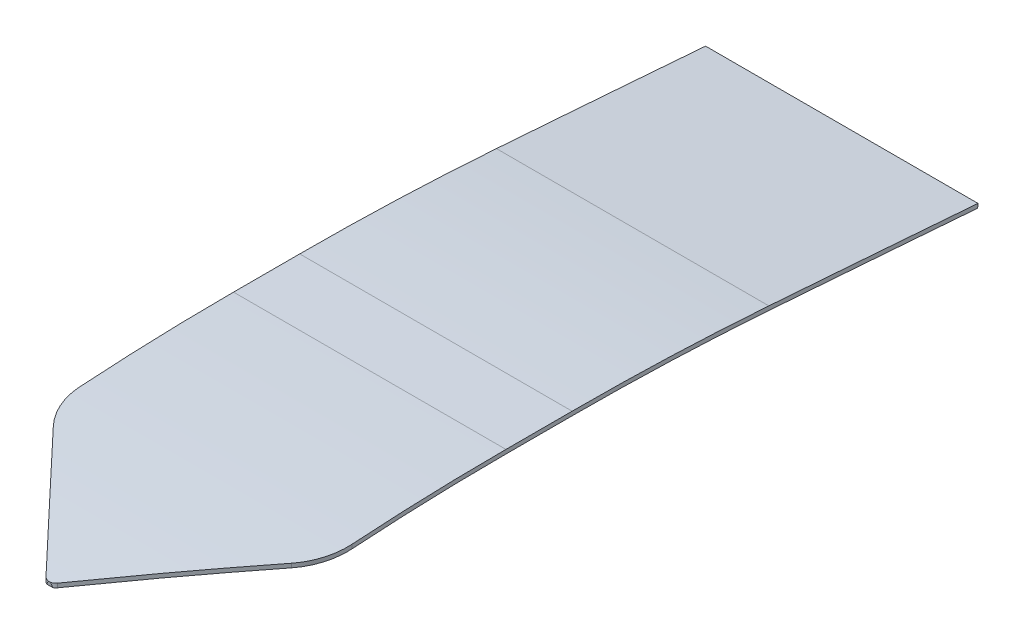
ISO-10303-21;
HEADER;
FILE_DESCRIPTION(('STEP AP214'),'2;1');
FILE_NAME('part.step','',(''),(''),'','','');
FILE_SCHEMA(('AUTOMOTIVE_DESIGN { 1 0 10303 214 1 1 1 1 }'));
ENDSEC;
DATA;
#1=APPLICATION_CONTEXT('core data for automotive mechanical design processes');
#2=APPLICATION_PROTOCOL_DEFINITION('international standard','automotive_design',2000,#1);
#3=PRODUCT_CONTEXT('',#1,'mechanical');
#4=PRODUCT('Part','Part','',(#3));
#5=PRODUCT_RELATED_PRODUCT_CATEGORY('part','',(#4));
#6=PRODUCT_DEFINITION_FORMATION('','',#4);
#7=PRODUCT_DEFINITION_CONTEXT('part definition',#1,'design');
#8=PRODUCT_DEFINITION('design','',#6,#7);
#9=PRODUCT_DEFINITION_SHAPE('','',#8);
#10=(LENGTH_UNIT() NAMED_UNIT(*) SI_UNIT(.MILLI.,.METRE.));
#11=(NAMED_UNIT(*) PLANE_ANGLE_UNIT() SI_UNIT($,.RADIAN.));
#12=(NAMED_UNIT(*) SI_UNIT($,.STERADIAN.) SOLID_ANGLE_UNIT());
#13=UNCERTAINTY_MEASURE_WITH_UNIT(LENGTH_MEASURE(1.E-05),#10,'distance_accuracy_value','');
#14=(GEOMETRIC_REPRESENTATION_CONTEXT(3) GLOBAL_UNCERTAINTY_ASSIGNED_CONTEXT((#13)) GLOBAL_UNIT_ASSIGNED_CONTEXT((#10,
#11,#12)) REPRESENTATION_CONTEXT('',''));
#15=CARTESIAN_POINT('',(0.,0.,0.));
#16=DIRECTION('',(0.,0.,1.));
#17=DIRECTION('',(1.,0.,0.));
#18=AXIS2_PLACEMENT_3D('',#15,#16,#17);
#19=CARTESIAN_POINT('',(45.2232043677211,2377.51338000155,4691.88338211628));
#20=DIRECTION('',(0.,-0.139077666980122,0.990281476423429));
#21=DIRECTION('',(0.,-0.990281476423429,-0.139077666980122));
#22=AXIS2_PLACEMENT_3D('',#19,#20,#21);
#23=PLANE('',#22);
#24=CARTESIAN_POINT('',(914.223204367722,2021.49594818593,4641.88338211628));
#25=DIRECTION('',(0.,-0.139077666980122,0.990281476423429));
#26=DIRECTION('',(0.,-0.990281476423429,-0.139077666980122));
#27=AXIS2_PLACEMENT_3D('',#24,#25,#26);
#28=ELLIPSE('',#27,359.511351359852,49.9999999999991);
#29=CARTESIAN_POINT('',(895.763025496517,2352.36023050039,4688.35080937499));
#30=VERTEX_POINT('',#29);
#31=CARTESIAN_POINT('',(914.223204367722,2377.51338000155,4691.88338211628));
#32=VERTEX_POINT('',#31);
#33=EDGE_CURVE('E270',#30,#32,#28,.F.);
#34=ORIENTED_EDGE('',*,*,#33,.F.);
#35=DIRECTION('',(1.,0.,0.));
#36=VECTOR('',#35,1.);
#37=CARTESIAN_POINT('',(45.2232043677211,2352.36023050039,4688.35080937499));
#38=LINE('',#37,#36);
#39=CARTESIAN_POINT('',(932.683383238927,2352.36023050039,4688.35080937499));
#40=VERTEX_POINT('',#39);
#41=EDGE_CURVE('E199',#30,#40,#38,.T.);
#42=ORIENTED_EDGE('',*,*,#41,.T.);
#43=EDGE_CURVE('E271',#32,#40,#28,.F.);
#44=ORIENTED_EDGE('',*,*,#43,.F.);
#45=EDGE_LOOP('',(#34,#42,#44));
#46=FACE_BOUND('',#45,.T.);
#47=ADVANCED_FACE('F37',(#46),#23,.T.);
#48=CARTESIAN_POINT('',(45.2232043677211,-264700.723222564,20532.1872081631));
#49=DIRECTION('',(1.,0.,0.));
#50=DIRECTION('',(0.,0.,-1.));
#51=AXIS2_PLACEMENT_3D('',#48,#49,#50);
#52=CYLINDRICAL_SURFACE('',#51,267886.279258507);
#53=CARTESIAN_POINT('',(1773.22320436773,-264700.723222564,20532.1872081631));
#54=DIRECTION('',(-1.,0.,0.));
#55=DIRECTION('',(0.,0.,1.));
#56=AXIS2_PLACEMENT_3D('',#53,#54,#55);
#57=CIRCLE('',#56,267886.279258507);
#58=CARTESIAN_POINT('',(1773.22320436772,2373.84259870677,-306.11661788372));
#59=VERTEX_POINT('',#58);
#60=CARTESIAN_POINT('',(1773.22320436772,2473.47300835498,1012.77422187486));
#61=VERTEX_POINT('',#60);
#62=EDGE_CURVE('E175',#59,#61,#57,.F.);
#63=ORIENTED_EDGE('',*,*,#62,.F.);
#64=DIRECTION('',(1.,0.,0.));
#65=VECTOR('',#64,1.);
#66=CARTESIAN_POINT('',(45.2232043677211,2373.84259870677,-306.11661788372));
#67=LINE('',#66,#65);
#68=CARTESIAN_POINT('',(55.2232043677214,2373.84259870683,-306.116617883722));
#69=VERTEX_POINT('',#68);
#70=EDGE_CURVE('E169',#69,#59,#67,.T.);
#71=ORIENTED_EDGE('',*,*,#70,.F.);
#72=CARTESIAN_POINT('',(55.2232043677226,-264700.723222564,20532.1872081631));
#73=DIRECTION('',(1.,0.,0.));
#74=DIRECTION('',(0.,0.,-1.));
#75=AXIS2_PLACEMENT_3D('',#72,#73,#74);
#76=CIRCLE('',#75,267886.279258507);
#77=CARTESIAN_POINT('',(55.2232043677215,2473.47300835498,1012.77422187486));
#78=VERTEX_POINT('',#77);
#79=EDGE_CURVE('E152',#78,#69,#76,.F.);
#80=ORIENTED_EDGE('',*,*,#79,.F.);
#81=DIRECTION('',(1.,0.,0.));
#82=VECTOR('',#81,1.);
#83=CARTESIAN_POINT('',(45.2232043677211,2473.47300835497,1012.77422187486));
#84=LINE('',#83,#82);
#85=EDGE_CURVE('E208',#78,#61,#84,.T.);
#86=ORIENTED_EDGE('',*,*,#85,.T.);
#87=EDGE_LOOP('',(#63,#71,#80,#86));
#88=FACE_BOUND('',#87,.T.);
#89=ADVANCED_FACE('F39',(#88),#52,.T.);
#90=CARTESIAN_POINT('',(45.2232043677211,2373.84259870677,-306.11661788372));
#91=DIRECTION('',(0.,-0.0777878728384363,-0.996969932765914));
#92=DIRECTION('',(0.,0.996969932765914,-0.0777878728384363));
#93=AXIS2_PLACEMENT_3D('',#90,#91,#92);
#94=PLANE('',#93);
#95=DIRECTION('',(0.,0.996969932765914,-0.0777878728384363));
#96=VECTOR('',#95,1.);
#97=CARTESIAN_POINT('',(1773.22320436772,2373.84259870677,-306.11661788372));
#98=LINE('',#97,#96);
#99=CARTESIAN_POINT('',(1773.22320436772,2348.51956241448,-304.14080591362));
#100=VERTEX_POINT('',#99);
#101=EDGE_CURVE('E335',#100,#59,#98,.T.);
#102=ORIENTED_EDGE('',*,*,#101,.F.);
#103=DIRECTION('',(1.,0.,0.));
#104=VECTOR('',#103,1.);
#105=CARTESIAN_POINT('',(45.2232043677211,2348.51956241448,-304.140805913644));
#106=LINE('',#105,#104);
#107=CARTESIAN_POINT('',(55.2232043677214,2348.51956241448,-304.14080591362));
#108=VERTEX_POINT('',#107);
#109=EDGE_CURVE('E171',#108,#100,#106,.T.);
#110=ORIENTED_EDGE('',*,*,#109,.F.);
#111=DIRECTION('',(0.,-0.996969932765914,0.0777878728384363));
#112=VECTOR('',#111,1.);
#113=CARTESIAN_POINT('',(55.2232043677214,2373.84259870677,-306.11661788372));
#114=LINE('',#113,#112);
#115=EDGE_CURVE('E155',#69,#108,#114,.T.);
#116=ORIENTED_EDGE('',*,*,#115,.F.);
#117=ORIENTED_EDGE('',*,*,#70,.T.);
#118=EDGE_LOOP('',(#102,#110,#116,#117));
#119=FACE_BOUND('',#118,.T.);
#120=ADVANCED_FACE('F168',(#119),#94,.T.);
#121=CARTESIAN_POINT('',(45.2232043677211,-264700.723222564,20532.1872081631));
#122=DIRECTION('',(1.,0.,0.));
#123=DIRECTION('',(0.,0.,-1.));
#124=AXIS2_PLACEMENT_3D('',#121,#122,#123);
#125=CYLINDRICAL_SURFACE('',#124,267860.879258507);
#126=CARTESIAN_POINT('',(1773.22320436773,-264700.723222564,20532.1872081631));
#127=DIRECTION('',(-1.,0.,0.));
#128=DIRECTION('',(0.,0.,1.));
#129=AXIS2_PLACEMENT_3D('',#126,#127,#128);
#130=CIRCLE('',#129,267860.879258507);
#131=CARTESIAN_POINT('',(1773.22320436772,2448.14052547071,1014.62498142564));
#132=VERTEX_POINT('',#131);
#133=EDGE_CURVE('E337',#132,#100,#130,.T.);
#134=ORIENTED_EDGE('',*,*,#133,.F.);
#135=DIRECTION('',(1.,0.,0.));
#136=VECTOR('',#135,1.);
#137=CARTESIAN_POINT('',(45.2232043677211,2448.14052547069,1014.62498142564));
#138=LINE('',#137,#136);
#139=CARTESIAN_POINT('',(55.2232043677215,2448.14052547071,1014.62498142564));
#140=VERTEX_POINT('',#139);
#141=EDGE_CURVE('E179',#140,#132,#138,.T.);
#142=ORIENTED_EDGE('',*,*,#141,.F.);
#143=CARTESIAN_POINT('',(55.2232043677226,-264700.723222564,20532.1872081631));
#144=DIRECTION('',(1.,0.,0.));
#145=DIRECTION('',(0.,0.,-1.));
#146=AXIS2_PLACEMENT_3D('',#143,#144,#145);
#147=CIRCLE('',#146,267860.879258507);
#148=EDGE_CURVE('E172',#108,#140,#147,.T.);
#149=ORIENTED_EDGE('',*,*,#148,.F.);
#150=ORIENTED_EDGE('',*,*,#109,.T.);
#151=EDGE_LOOP('',(#134,#142,#149,#150));
#152=FACE_BOUND('',#151,.T.);
#153=ADVANCED_FACE('F282',(#152),#125,.F.);
#154=CARTESIAN_POINT('',(45.2232043677211,-14509.8457253538,2253.55427068807));
#155=DIRECTION('',(1.,0.,0.));
#156=DIRECTION('',(0.,0.,-1.));
#157=AXIS2_PLACEMENT_3D('',#154,#155,#156);
#158=CYLINDRICAL_SURFACE('',#157,17003.1833333334);
#159=CARTESIAN_POINT('',(1773.22320436772,-14509.8457253538,2253.55427068807));
#160=DIRECTION('',(-1.,0.,0.));
#161=DIRECTION('',(0.,0.,1.));
#162=AXIS2_PLACEMENT_3D('',#159,#160,#161);
#163=CIRCLE('',#162,17003.1833333334);
#164=CARTESIAN_POINT('',(1773.22320436772,2493.33760797954,2253.55427068807));
#165=VERTEX_POINT('',#164);
#166=EDGE_CURVE('E339',#165,#132,#163,.T.);
#167=ORIENTED_EDGE('',*,*,#166,.F.);
#168=DIRECTION('',(1.,0.,0.));
#169=VECTOR('',#168,1.);
#170=CARTESIAN_POINT('',(45.2232043677211,2493.33760797949,2253.55427068807));
#171=LINE('',#170,#169);
#172=CARTESIAN_POINT('',(55.2232043677216,2493.33760797954,2253.55427068807));
#173=VERTEX_POINT('',#172);
#174=EDGE_CURVE('E193',#173,#165,#171,.T.);
#175=ORIENTED_EDGE('',*,*,#174,.F.);
#176=CARTESIAN_POINT('',(55.2232043677216,-14509.8457253538,2253.55427068807));
#177=DIRECTION('',(1.,0.,0.));
#178=DIRECTION('',(0.,0.,-1.));
#179=AXIS2_PLACEMENT_3D('',#176,#177,#178);
#180=CIRCLE('',#179,17003.1833333334);
#181=EDGE_CURVE('E324',#140,#173,#180,.T.);
#182=ORIENTED_EDGE('',*,*,#181,.F.);
#183=ORIENTED_EDGE('',*,*,#141,.T.);
#184=EDGE_LOOP('',(#167,#175,#182,#183));
#185=FACE_BOUND('',#184,.T.);
#186=ADVANCED_FACE('F284',(#185),#158,.F.);
#187=CARTESIAN_POINT('',(45.2232043677211,2493.33760797949,2670.88338211628));
#188=DIRECTION('',(0.,-1.,0.));
#189=DIRECTION('',(0.,0.,-1.));
#190=AXIS2_PLACEMENT_3D('',#187,#188,#189);
#191=PLANE('',#190);
#192=DIRECTION('',(0.,0.,-1.));
#193=VECTOR('',#192,1.);
#194=CARTESIAN_POINT('',(1773.22320436772,2493.33760797949,2670.88338211628));
#195=LINE('',#194,#193);
#196=CARTESIAN_POINT('',(1773.22320436772,2493.33760797949,2670.88338211628));
#197=VERTEX_POINT('',#196);
#198=EDGE_CURVE('E341',#197,#165,#195,.T.);
#199=ORIENTED_EDGE('',*,*,#198,.F.);
#200=DIRECTION('',(1.,0.,0.));
#201=VECTOR('',#200,1.);
#202=CARTESIAN_POINT('',(45.2232043677211,2493.33760797949,2670.88338211628));
#203=LINE('',#202,#201);
#204=CARTESIAN_POINT('',(55.2232043677216,2493.33760797949,2670.88338211628));
#205=VERTEX_POINT('',#204);
#206=EDGE_CURVE('E196',#205,#197,#203,.T.);
#207=ORIENTED_EDGE('',*,*,#206,.F.);
#208=DIRECTION('',(0.,0.,1.));
#209=VECTOR('',#208,1.);
#210=CARTESIAN_POINT('',(55.2232043677216,2493.33760797949,2670.88338211628));
#211=LINE('',#210,#209);
#212=EDGE_CURVE('E326',#173,#205,#211,.T.);
#213=ORIENTED_EDGE('',*,*,#212,.F.);
#214=ORIENTED_EDGE('',*,*,#174,.T.);
#215=EDGE_LOOP('',(#199,#207,#213,#214));
#216=FACE_BOUND('',#215,.T.);
#217=ADVANCED_FACE('F259',(#216),#191,.T.);
#218=CARTESIAN_POINT('',(45.2232043677211,-12012.7112139923,2670.88338211628));
#219=DIRECTION('',(1.,0.,0.));
#220=DIRECTION('',(0.,0.,-1.));
#221=AXIS2_PLACEMENT_3D('',#218,#219,#220);
#222=CYLINDRICAL_SURFACE('',#221,14506.0488219718);
#223=CARTESIAN_POINT('',(932.683383238925,2352.36023050039,4688.35080937499));
#224=CARTESIAN_POINT('',(933.341442367758,2352.39694465635,4688.08939134966));
#225=CARTESIAN_POINT('',(933.993840519336,2352.43561166281,4687.81401739661));
#226=CARTESIAN_POINT('',(935.286167259724,2352.51676767956,4687.23591718592));
#227=CARTESIAN_POINT('',(935.926095757157,2352.55925671784,4686.93319072793));
#228=CARTESIAN_POINT('',(937.192614543316,2352.64799278347,4686.30080478515));
#229=CARTESIAN_POINT('',(937.819198618152,2352.69424151526,4685.97113308452));
#230=CARTESIAN_POINT('',(939.057550258622,2352.79038104461,4685.28564288533));
#231=CARTESIAN_POINT('',(939.669318047082,2352.84027178737,4684.92982478033));
#232=CARTESIAN_POINT('',(941.458881344512,2352.99338892204,4683.83748533384));
#233=CARTESIAN_POINT('',(942.614203932002,2353.10169483297,4683.06443247719));
#234=CARTESIAN_POINT('',(944.855043683963,2353.33109566457,4681.42596207093));
#235=CARTESIAN_POINT('',(945.940602322678,2353.45218287154,4680.56060022784));
#236=CARTESIAN_POINT('',(947.308591228943,2353.61811529406,4679.37388669945));
#237=CARTESIAN_POINT('',(947.625940812935,2353.65760370346,4679.09141492476));
#238=CARTESIAN_POINT('',(948.253224670541,2353.73766542757,4678.51858405135));
#239=CARTESIAN_POINT('',(948.56316027037,2353.77823854544,4678.22822638342));
#240=CARTESIAN_POINT('',(949.177185712854,2353.86067780513,4677.63812360825));
#241=CARTESIAN_POINT('',(949.481232653833,2353.90254995547,4677.33833474451));
#242=CARTESIAN_POINT('',(950.081531201921,2353.98734529348,4676.73108971094));
#243=CARTESIAN_POINT('',(950.37778141235,2354.03026866683,4676.42363218633));
#244=CARTESIAN_POINT('',(950.670011748799,2354.07369926341,4676.11246670419));
#245=B_SPLINE_CURVE_WITH_KNOTS('',3,(#223,#224,#225,#226,#227,#228,#229,#230,#231,#232,#233,
#234,#235,#236,#237,#238,#239,#240,#241,#242,#243,#244),.UNSPECIFIED.,.F.,.F.,(4,2,2,2,2,2,2,2,
2,2,4),(0.,2.12692618644326,4.2538679531693,6.3817793920735,8.50965880887939,12.6874613425271,
16.8627567730322,18.142727355165,19.4224672375952,20.7094348068825,21.9966313714263),.UNSPECIFIED.);
#246=CARTESIAN_POINT('',(950.670011748799,2354.07369926341,4676.11246670419));
#247=VERTEX_POINT('',#246);
#248=EDGE_CURVE('E182',#40,#247,#245,.T.);
#249=ORIENTED_EDGE('',*,*,#248,.F.);
#250=ORIENTED_EDGE('',*,*,#41,.F.);
#251=CARTESIAN_POINT('',(877.776396986645,2354.07369926341,4676.11246670419));
#252=CARTESIAN_POINT('',(878.259275190629,2354.00193356546,4676.62664365774));
#253=CARTESIAN_POINT('',(878.753140266467,2353.93155365623,4677.13069004759));
#254=CARTESIAN_POINT('',(879.761972475992,2353.793695661,4678.11763712768));
#255=CARTESIAN_POINT('',(880.276940007072,2353.72621762971,4678.60053741935));
#256=CARTESIAN_POINT('',(881.327376734287,2353.59425997595,4679.54454850722));
#257=CARTESIAN_POINT('',(881.86285707957,2353.52978202749,4680.00564714064));
#258=CARTESIAN_POINT('',(882.953055787725,2353.40399554704,4680.90487896266));
#259=CARTESIAN_POINT('',(883.507773800373,2353.34268695742,4681.34301256898));
#260=CARTESIAN_POINT('',(885.178822692211,2353.16586936609,4682.60621729297));
#261=CARTESIAN_POINT('',(886.321462773817,2353.05503311584,4683.39751142927));
#262=CARTESIAN_POINT('',(888.668883830047,2352.84695416432,4684.88226613484));
#263=CARTESIAN_POINT('',(889.873625086204,2352.74970291853,4685.57578820214));
#264=CARTESIAN_POINT('',(891.482695084165,2352.6319913338,4686.41484006754));
#265=CARTESIAN_POINT('',(891.86275519936,2352.60504497918,4686.60688519246));
#266=CARTESIAN_POINT('',(892.627685844551,2352.55251411081,4686.98121784292));
#267=CARTESIAN_POINT('',(893.012555520853,2352.52692935952,4687.16350707062));
#268=CARTESIAN_POINT('',(893.789091400089,2352.47699645283,4687.51922836298));
#269=CARTESIAN_POINT('',(894.180783768897,2352.45265613317,4687.69260433496));
#270=CARTESIAN_POINT('',(894.9686348429,2352.40538237009,4688.02929334449));
#271=CARTESIAN_POINT('',(895.364794315635,2352.38244917295,4688.19260462056));
#272=CARTESIAN_POINT('',(895.763025496519,2352.36023050039,4688.35080937499));
#273=B_SPLINE_CURVE_WITH_KNOTS('',3,(#251,#252,#253,#254,#255,#256,#257,#258,#259,#260,#261,
#262,#263,#264,#265,#266,#267,#268,#269,#270,#271,#272),.UNSPECIFIED.,.F.,.F.,(4,2,2,2,2,2,2,2,
2,2,4),(0.,2.1268720399877,4.25378415081409,6.38186915845638,8.50991544425092,12.6876720812845,
16.8627890973179,18.1427323273964,19.4224515071806,20.709428118154,21.9966293333857),.UNSPECIFIED.);
#274=CARTESIAN_POINT('',(877.776396986645,2354.07369926341,4676.11246670419));
#275=VERTEX_POINT('',#274);
#276=EDGE_CURVE('E66',#275,#30,#273,.T.);
#277=ORIENTED_EDGE('',*,*,#276,.F.);
#278=CARTESIAN_POINT('',(-1005.43809795815,-12012.7112139923,2670.88338211628));
#279=DIRECTION('',(0.728936147621554,0.,-0.684581691758294));
#280=DIRECTION('',(0.684581691758294,0.,0.728936147621554));
#281=AXIS2_PLACEMENT_3D('',#278,#279,#280);
#282=ELLIPSE('',#281,19900.3011022345,14506.0488219718);
#283=CARTESIAN_POINT('',(163.6487453191,2439.82641897862,3915.7160588196));
#284=VERTEX_POINT('',#283);
#285=EDGE_CURVE('E248',#284,#275,#282,.T.);
#286=ORIENTED_EDGE('',*,*,#285,.F.);
#287=CARTESIAN_POINT('',(55.223204367722,2460.80292133189,3641.88338211628));
#288=CARTESIAN_POINT('',(55.2232039741585,2460.61391931573,3644.70060950368));
#289=CARTESIAN_POINT('',(55.2529681342459,2460.42409933992,3647.51770326978));
#290=CARTESIAN_POINT('',(55.3719974064149,2460.04290125643,3653.15051077667));
#291=CARTESIAN_POINT('',(55.4612621557714,2459.85152315826,3655.96622452576));
#292=CARTESIAN_POINT('',(55.818252136738,2459.27518662316,3664.40935970784));
#293=CARTESIAN_POINT('',(56.1751731079108,2458.88800454576,3670.03309404743));
#294=CARTESIAN_POINT('',(57.1262144592865,2458.10849425698,3681.26007410751));
#295=CARTESIAN_POINT('',(57.7203332874732,2457.71616607928,3686.86331996182));
#296=CARTESIAN_POINT('',(58.7885027266679,2457.1244300353,3695.24499265891));
#297=CARTESIAN_POINT('',(59.1740631127102,2456.92664179741,3698.03504903783));
#298=CARTESIAN_POINT('',(60.004039098009,2456.53006425242,3703.60650931769));
#299=CARTESIAN_POINT('',(60.4484585314915,2456.33127488092,3706.38791264286));
#300=CARTESIAN_POINT('',(61.8708045981704,2455.73311028724,3714.72355998896));
#301=CARTESIAN_POINT('',(62.9370089421707,2455.3323874279,3720.26288470834));
#302=CARTESIAN_POINT('',(65.3026627321889,2454.52826107803,3731.2913060384));
#303=CARTESIAN_POINT('',(66.6021122258106,2454.12485758696,3736.78040263881));
#304=CARTESIAN_POINT('',(68.7243468140056,2453.51844776769,3744.96871077912));
#305=CARTESIAN_POINT('',(69.4606157967758,2453.3160902613,3747.69063683057));
#306=CARTESIAN_POINT('',(70.9904826275301,2452.91106175908,3753.11810974383));
#307=CARTESIAN_POINT('',(71.7840767306166,2452.70839078458,3755.82365766309));
#308=CARTESIAN_POINT('',(74.2504446497932,2452.10005515378,3763.91431608964));
#309=CARTESIAN_POINT('',(76.008837924964,2451.69405811608,3769.27357185834));
#310=CARTESIAN_POINT('',(79.7516882924569,2450.88196954528,3779.91590945318));
#311=CARTESIAN_POINT('',(81.7362772354231,2450.4758780962,3785.19894480801));
#312=CARTESIAN_POINT('',(85.927203754222,2449.66482350464,3795.67642288359));
#313=CARTESIAN_POINT('',(88.1335419959035,2449.25986036555,3800.87086533827));
#314=CARTESIAN_POINT('',(92.7645125790225,2448.45200962682,3811.16286180976));
#315=CARTESIAN_POINT('',(95.1891793170256,2448.04912236485,3816.2604004061));
#316=CARTESIAN_POINT('',(98.9861710967571,2447.44722219097,3823.82606471086));
#317=CARTESIAN_POINT('',(100.278508794284,2447.24699268801,3826.33452748728));
#318=CARTESIAN_POINT('',(102.91609181821,2446.8474511575,3831.32377169471));
#319=CARTESIAN_POINT('',(104.261340609985,2446.64813919101,3833.80455129892));
#320=CARTESIAN_POINT('',(108.369099486819,2446.05271978606,3841.19201774405));
#321=CARTESIAN_POINT('',(111.209596576016,2445.6581814774,3846.05573485811));
#322=CARTESIAN_POINT('',(117.093617257916,2444.8744050214,3855.65918602735));
#323=CARTESIAN_POINT('',(120.137140278273,2444.48516685913,3860.39892043199));
#324=CARTESIAN_POINT('',(124.849772746383,2443.90619613452,3867.40792314061));
#325=CARTESIAN_POINT('',(126.444870712127,2443.71405868068,3869.7270319969));
#326=CARTESIAN_POINT('',(129.683619824998,2443.33152128008,3874.3310116714));
#327=CARTESIAN_POINT('',(131.327268196573,2443.14112123481,3876.61588443563));
#328=CARTESIAN_POINT('',(136.329787879781,2442.57274985391,3883.41735944796));
#329=CARTESIAN_POINT('',(139.760771675227,2442.19754115484,3887.88161843164));
#330=CARTESIAN_POINT('',(144.905500435811,2441.65595319808,3894.29105437421));
#331=CARTESIAN_POINT('',(146.546311165779,2441.4861940148,3896.29502597016));
#332=CARTESIAN_POINT('',(149.866375084172,2441.14860529938,3900.27051717196));
#333=CARTESIAN_POINT('',(151.545621535275,2440.98077543669,3902.24204236268));
#334=CARTESIAN_POINT('',(154.940334737598,2440.64730365408,3906.15008521847));
#335=CARTESIAN_POINT('',(156.655760510094,2440.48165957141,3908.08663831652));
#336=CARTESIAN_POINT('',(160.124248484512,2440.15244844874,3911.92652993114));
#337=CARTESIAN_POINT('',(161.877317124839,2439.9888817718,3913.82986266316));
#338=CARTESIAN_POINT('',(163.6487453191,2439.82641897863,3915.7160588196));
#339=B_SPLINE_CURVE_WITH_KNOTS('',3,(#287,#288,#289,#290,#291,#292,#293,#294,#295,#296,#297,
#298,#299,#300,#301,#302,#303,#304,#305,#306,#307,#308,#309,#310,#311,#312,#313,#314,#315,#316,
#317,#318,#319,#320,#321,#322,#323,#324,#325,#326,#327,#328,#329,#330,#331,#332,#333,#334,#335,
#336,#337,#338),.UNSPECIFIED.,.F.,.F.,(4,2,2,2,2,2,2,2,2,2,2,2,2,2,2,2,2,2,2,2,2,2,2,2,2,4),(0.,
8.47036647291138,16.9406813095799,33.8803526973032,50.8199132483838,59.2898855411439,
67.7604098607774,84.7207141456213,101.681021891958,110.161465638647,118.641355880663,
135.600730928071,152.57004273624,169.53940549986,186.511446395171,194.997571869619,
203.484254065534,220.417596344696,237.350890889486,245.814115315624,254.27685684522,
271.19944317773,278.98580513598,286.7708125352,294.547431249642,302.325390835472),.UNSPECIFIED.);
#340=CARTESIAN_POINT('',(55.2232043677217,2460.80292133189,3641.88338211628));
#341=VERTEX_POINT('',#340);
#342=EDGE_CURVE('E240',#341,#284,#339,.T.);
#343=ORIENTED_EDGE('',*,*,#342,.F.);
#344=CARTESIAN_POINT('',(55.2232043677216,-12012.7112139923,2670.88338211628));
#345=DIRECTION('',(1.,0.,0.));
#346=DIRECTION('',(0.,0.,-1.));
#347=AXIS2_PLACEMENT_3D('',#344,#345,#346);
#348=CIRCLE('',#347,14506.0488219718);
#349=EDGE_CURVE('E328',#205,#341,#348,.T.);
#350=ORIENTED_EDGE('',*,*,#349,.F.);
#351=ORIENTED_EDGE('',*,*,#206,.T.);
#352=CARTESIAN_POINT('',(1773.22320436772,-12012.7112139923,2670.88338211628));
#353=DIRECTION('',(-1.,0.,0.));
#354=DIRECTION('',(0.,0.,1.));
#355=AXIS2_PLACEMENT_3D('',#352,#353,#354);
#356=CIRCLE('',#355,14506.0488219718);
#357=CARTESIAN_POINT('',(1773.22320436772,2460.80292133189,3641.88338211628));
#358=VERTEX_POINT('',#357);
#359=EDGE_CURVE('E342',#358,#197,#356,.T.);
#360=ORIENTED_EDGE('',*,*,#359,.F.);
#361=CARTESIAN_POINT('',(1664.79766341634,2439.82641897862,3915.7160588196));
#362=CARTESIAN_POINT('',(1666.72627715377,2440.00329798813,3913.66248959705));
#363=CARTESIAN_POINT('',(1668.63308459297,2440.18148092235,3911.58866151491));
#364=CARTESIAN_POINT('',(1672.40234890509,2440.54033131731,3907.40131935892));
#365=CARTESIAN_POINT('',(1674.26480605295,2440.72099876265,3905.28780553123));
#366=CARTESIAN_POINT('',(1679.78436957252,2441.26652534247,3898.88918905159));
#367=CARTESIAN_POINT('',(1683.37388937959,2441.63492903509,3894.54577569072));
#368=CARTESIAN_POINT('',(1690.36589114484,2442.38007708064,3885.71169913934));
#369=CARTESIAN_POINT('',(1693.76837521365,2442.75682133936,3881.22103761139));
#370=CARTESIAN_POINT('',(1698.72715968395,2443.32736255762,3874.38092480678));
#371=CARTESIAN_POINT('',(1700.35594872694,2443.51844932173,3872.083506877));
#372=CARTESIAN_POINT('',(1703.56468944666,2443.90231831066,3867.45473257614));
#373=CARTESIAN_POINT('',(1705.14463793401,2444.09510064515,3865.12337400324));
#374=CARTESIAN_POINT('',(1709.81354240264,2444.67621175644,3858.07481165955));
#375=CARTESIAN_POINT('',(1712.82793058121,2445.0668871409,3853.30812401472));
#376=CARTESIAN_POINT('',(1718.65230732213,2445.853373878,3843.65187938756));
#377=CARTESIAN_POINT('',(1721.46229582629,2446.24918523212,3838.76232237024));
#378=CARTESIAN_POINT('',(1725.52011708875,2446.84592844443,3831.3427002339));
#379=CARTESIAN_POINT('',(1726.84655274482,2447.04535077891,3828.8552335074));
#380=CARTESIAN_POINT('',(1729.44643265808,2447.44506758469,3823.85304044387));
#381=CARTESIAN_POINT('',(1730.71988036982,2447.6453619982,3821.33831589742));
#382=CARTESIAN_POINT('',(1734.46006829568,2448.24738504643,3813.75456387179));
#383=CARTESIAN_POINT('',(1736.84671790682,2448.65026299431,3808.64583987003));
#384=CARTESIAN_POINT('',(1741.40310785738,2449.45821350249,3798.32946205557));
#385=CARTESIAN_POINT('',(1743.5727252931,2449.86328717087,3793.12175415311));
#386=CARTESIAN_POINT('',(1747.6897783007,2450.67439997938,3782.61929805693));
#387=CARTESIAN_POINT('',(1749.63721321021,2451.08043912237,3777.32454960377));
#388=CARTESIAN_POINT('',(1753.30675865773,2451.89256470027,3766.65642825795));
#389=CARTESIAN_POINT('',(1755.02883383848,2452.29865113261,3761.28304317447));
#390=CARTESIAN_POINT('',(1757.44022774588,2452.90700138746,3753.17235767778));
#391=CARTESIAN_POINT('',(1758.21541018148,2453.10965616181,3750.46034421587));
#392=CARTESIAN_POINT('',(1759.70829830262,2453.51461382124,3745.02032124319));
#393=CARTESIAN_POINT('',(1760.42600022111,2453.7169166824,3742.2923106966));
#394=CARTESIAN_POINT('',(1762.48913673428,2454.32217370793,3734.09894327677));
#395=CARTESIAN_POINT('',(1763.74836638763,2454.72442642019,3728.61158657422));
#396=CARTESIAN_POINT('',(1766.0341364918,2455.52611790339,3717.58843660259));
#397=CARTESIAN_POINT('',(1767.06067757507,2455.92555668197,3712.05264346519));
#398=CARTESIAN_POINT('',(1768.42436570868,2456.52185210238,3703.72153750712));
#399=CARTESIAN_POINT('',(1768.8495065964,2456.72010047511,3700.94049572475));
#400=CARTESIAN_POINT('',(1769.64101032442,2457.11556572194,3695.37017411275));
#401=CARTESIAN_POINT('',(1770.00737651512,2457.31278265422,3692.58089476193));
#402=CARTESIAN_POINT('',(1771.01800452506,2457.90271214397,3684.20285868486));
#403=CARTESIAN_POINT('',(1771.57395089706,2458.29377123481,3678.60295623608));
#404=CARTESIAN_POINT('',(1772.21348636179,2458.861439979,3670.40531095767));
#405=CARTESIAN_POINT('',(1772.39023421242,2459.04014508795,3667.81456314274));
#406=CARTESIAN_POINT('',(1772.69322802163,2459.39633715702,3662.63042705861));
#407=CARTESIAN_POINT('',(1772.81948277011,2459.57382432387,3660.03703932784));
#408=CARTESIAN_POINT('',(1773.02136161875,2459.9273436798,3654.85104001099));
#409=CARTESIAN_POINT('',(1773.09704048254,2460.10337723812,3652.25843063367));
#410=CARTESIAN_POINT('',(1773.1979675757,2460.4541470074,3647.07169318897));
#411=CARTESIAN_POINT('',(1773.22320710116,2460.62888298928,3644.47756493672));
#412=CARTESIAN_POINT('',(1773.22320436772,2460.80292133189,3641.88338211628));
#413=B_SPLINE_CURVE_WITH_KNOTS('',3,(#361,#362,#363,#364,#365,#366,#367,#368,#369,#370,#371,
#372,#373,#374,#375,#376,#377,#378,#379,#380,#381,#382,#383,#384,#385,#386,#387,#388,#389,#390,
#391,#392,#393,#394,#395,#396,#397,#398,#399,#400,#401,#402,#403,#404,#405,#406,#407,#408,#409,
#410,#411,#412),.UNSPECIFIED.,.F.,.F.,(4,2,2,2,2,2,2,2,2,2,2,2,2,2,2,2,2,2,2,2,2,2,2,2,2,4),(0.,
8.46797063386074,16.9358887611582,33.8707538224417,50.8054277391675,59.2729586632089,
67.7410413674582,84.695771204293,101.650505867466,110.128174182739,118.605288928818,
135.559113797131,152.522485774653,169.485908321639,186.451989120672,194.935134792878,
203.418835961977,220.3465333145,237.274184657062,245.734602843378,254.19453858039,
271.111524133289,278.919910251174,286.726936480707,294.525495493713,302.325400124559),.UNSPECIFIED.);
#414=CARTESIAN_POINT('',(1664.79766341634,2439.82641897862,3915.7160588196));
#415=VERTEX_POINT('',#414);
#416=EDGE_CURVE('E247',#415,#358,#413,.T.);
#417=ORIENTED_EDGE('',*,*,#416,.F.);
#418=CARTESIAN_POINT('',(2833.88450669359,-12012.7112139923,2670.88338211628));
#419=DIRECTION('',(-0.728936147621554,0.,-0.684581691758294));
#420=DIRECTION('',(0.684581691758294,0.,-0.728936147621554));
#421=AXIS2_PLACEMENT_3D('',#418,#419,#420);
#422=ELLIPSE('',#421,19900.3011022345,14506.0488219718);
#423=EDGE_CURVE('E305',#247,#415,#422,.T.);
#424=ORIENTED_EDGE('',*,*,#423,.F.);
#425=EDGE_LOOP('',(#249,#250,#277,#286,#343,#350,#351,#360,#417,#424));
#426=FACE_BOUND('',#425,.T.);
#427=ADVANCED_FACE('F255',(#426),#222,.F.);
#428=CARTESIAN_POINT('',(45.2232043677211,-12012.7112139923,2670.88338211628));
#429=DIRECTION('',(1.,0.,0.));
#430=DIRECTION('',(0.,0.,-1.));
#431=AXIS2_PLACEMENT_3D('',#428,#429,#430);
#432=CYLINDRICAL_SURFACE('',#431,14531.4488219718);
#433=CARTESIAN_POINT('',(1773.22320436772,-12012.7112139923,2670.88338211628));
#434=DIRECTION('',(-1.,0.,0.));
#435=DIRECTION('',(0.,0.,1.));
#436=AXIS2_PLACEMENT_3D('',#433,#434,#435);
#437=CIRCLE('',#436,14531.4488219718);
#438=CARTESIAN_POINT('',(1773.22320436772,2518.73760797949,2670.88338211628));
#439=VERTEX_POINT('',#438);
#440=CARTESIAN_POINT('',(1773.22320436772,2486.25991728406,3641.88338211628));
#441=VERTEX_POINT('',#440);
#442=EDGE_CURVE('E332',#439,#441,#437,.F.);
#443=ORIENTED_EDGE('',*,*,#442,.F.);
#444=DIRECTION('',(1.,0.,0.));
#445=VECTOR('',#444,1.);
#446=CARTESIAN_POINT('',(45.2232043677211,2518.73760797949,2670.88338211628));
#447=LINE('',#446,#445);
#448=CARTESIAN_POINT('',(55.2232043677216,2518.73760797949,2670.88338211628));
#449=VERTEX_POINT('',#448);
#450=EDGE_CURVE('E202',#449,#439,#447,.T.);
#451=ORIENTED_EDGE('',*,*,#450,.F.);
#452=CARTESIAN_POINT('',(55.2232043677216,-12012.7112139923,2670.88338211628));
#453=DIRECTION('',(1.,0.,0.));
#454=DIRECTION('',(0.,0.,-1.));
#455=AXIS2_PLACEMENT_3D('',#452,#453,#454);
#456=CIRCLE('',#455,14531.4488219718);
#457=CARTESIAN_POINT('',(55.2232043677217,2486.25991728406,3641.88338211628));
#458=VERTEX_POINT('',#457);
#459=EDGE_CURVE('E162',#458,#449,#456,.F.);
#460=ORIENTED_EDGE('',*,*,#459,.F.);
#461=CARTESIAN_POINT('',(163.6487453191,2465.32029835761,3915.7160588196));
#462=CARTESIAN_POINT('',(161.720149160359,2465.49686429741,3913.66250831497));
#463=CARTESIAN_POINT('',(159.813358705482,2465.67473187167,3911.5886991098));
#464=CARTESIAN_POINT('',(156.04412719223,2466.03294718787,3907.4013949942));
#465=CARTESIAN_POINT('',(154.18168585897,2466.21329491441,3905.28790032989));
#466=CARTESIAN_POINT('',(148.662168038221,2466.75785616487,3898.8893417002));
#467=CARTESIAN_POINT('',(145.07267639558,2467.12560803584,3894.54596741252));
#468=CARTESIAN_POINT('',(138.080726424598,2467.86943787539,3885.71196968195));
#469=CARTESIAN_POINT('',(134.678265991279,2468.24551575018,3881.2213478972));
#470=CARTESIAN_POINT('',(129.719513793988,2468.81504794385,3874.38129518138));
#471=CARTESIAN_POINT('',(128.090734980191,2469.00579678753,3872.08389736264));
#472=CARTESIAN_POINT('',(124.882013680844,2469.38898698722,3867.45516342643));
#473=CARTESIAN_POINT('',(123.302074384599,2469.58142845271,3865.12382510714));
#474=CARTESIAN_POINT('',(118.633196278282,2470.16151210934,3858.07532420467));
#475=CARTESIAN_POINT('',(115.618823723047,2470.55149683489,3853.3086779516));
#476=CARTESIAN_POINT('',(109.794474281705,2471.33659338339,3843.65251654671));
#477=CARTESIAN_POINT('',(106.984497453662,2471.7317052078,3838.76300135998));
#478=CARTESIAN_POINT('',(102.92669087025,2472.32739393319,3831.34344227317));
#479=CARTESIAN_POINT('',(101.600259640091,2472.52646389947,3828.85599662505));
#480=CARTESIAN_POINT('',(99.000387645611,2472.92547448016,3823.85384580773));
#481=CARTESIAN_POINT('',(97.726943426816,2473.12541503686,3821.33914242912));
#482=CARTESIAN_POINT('',(93.9867646060212,2473.7263745791,3813.75545404032));
#483=CARTESIAN_POINT('',(91.6001192327453,2474.12854092555,3808.64677264057));
#484=CARTESIAN_POINT('',(87.0437338449884,2474.93506462392,3798.33047958006));
#485=CARTESIAN_POINT('',(84.8741167667672,2475.33942308239,3793.12281381453));
#486=CARTESIAN_POINT('',(80.7570610716119,2476.14910396698,3782.62044232064));
#487=CARTESIAN_POINT('',(78.8096231170338,2476.55442639598,3777.32573633284));
#488=CARTESIAN_POINT('',(75.1400682327777,2477.36511865653,3766.6577002803));
#489=CARTESIAN_POINT('',(73.4179866597547,2477.77048848556,3761.28435802482));
#490=CARTESIAN_POINT('',(71.006580673309,2478.37776535124,3753.17373705418));
#491=CARTESIAN_POINT('',(70.2313937960816,2478.58006257966,3750.46174514785));
#492=CARTESIAN_POINT('',(68.7384959607068,2478.98430581408,3745.02176538645));
#493=CARTESIAN_POINT('',(68.0207887695504,2479.18625179621,3742.29377649556));
#494=CARTESIAN_POINT('',(65.9576351295118,2479.79044119133,3734.10047374967));
#495=CARTESIAN_POINT('',(64.6983923958637,2480.19198445689,3728.61316021485));
#496=CARTESIAN_POINT('',(62.4125928145099,2480.99226218268,3717.59009699511));
#497=CARTESIAN_POINT('',(61.3860353344741,2481.39099665053,3712.05434744186));
#498=CARTESIAN_POINT('',(60.0223200717752,2481.98624078015,3703.72330713253));
#499=CARTESIAN_POINT('',(59.5971697188058,2482.18413965625,3700.94228725693));
#500=CARTESIAN_POINT('',(58.8056462082815,2482.57890776939,3695.37200956163));
#501=CARTESIAN_POINT('',(58.439269700336,2482.7757770645,3692.58275222074));
#502=CARTESIAN_POINT('',(57.4286094428609,2483.3646667388,3684.20478230846));
#503=CARTESIAN_POINT('',(56.8726398449648,2483.75503662634,3678.604924177));
#504=CARTESIAN_POINT('',(56.2330531664562,2484.3217180216,3670.40715593271));
#505=CARTESIAN_POINT('',(56.0562823917121,2484.5001211458,3667.81624044048));
#506=CARTESIAN_POINT('',(55.7532493029359,2484.85571124409,3662.63176875245));
#507=CARTESIAN_POINT('',(55.6269781973764,2485.03289842459,3660.03821309518));
#508=CARTESIAN_POINT('',(55.4250732131097,2485.38582018857,3654.85187815437));
#509=CARTESIAN_POINT('',(55.3493845609869,2485.56155613913,3652.25910107981));
#510=CARTESIAN_POINT('',(55.2484444183455,2485.91173280845,3647.07202830223));
#511=CARTESIAN_POINT('',(55.223201633302,2486.08617329848,3644.47773241437));
#512=CARTESIAN_POINT('',(55.223204367722,2486.25991728406,3641.88338211628));
#513=B_SPLINE_CURVE_WITH_KNOTS('',3,(#461,#462,#463,#464,#465,#466,#467,#468,#469,#470,#471,
#472,#473,#474,#475,#476,#477,#478,#479,#480,#481,#482,#483,#484,#485,#486,#487,#488,#489,#490,
#491,#492,#493,#494,#495,#496,#497,#498,#499,#500,#501,#502,#503,#504,#505,#506,#507,#508,#509,
#510,#511,#512),.UNSPECIFIED.,.F.,.F.,(4,2,2,2,2,2,2,2,2,2,2,2,2,2,2,2,2,2,2,2,2,2,2,2,2,4),(0.,
8.46783495867948,16.9356174185485,33.8702112622425,50.8046144731779,59.272010025305,
67.7399573499383,84.6944145268009,101.648876520025,110.126408422602,118.603386766115,
135.556938831104,152.520040536448,169.483192810527,186.449003287991,194.932013801265,
203.415579803301,220.343008526523,237.270391248328,245.730675281956,254.190476867397,
271.107194223882,278.916023462205,286.72349266288,294.522493755453,302.322840610376),.UNSPECIFIED.);
#514=CARTESIAN_POINT('',(163.6487453191,2465.32029835761,3915.7160588196));
#515=VERTEX_POINT('',#514);
#516=EDGE_CURVE('E213',#515,#458,#513,.T.);
#517=ORIENTED_EDGE('',*,*,#516,.F.);
#518=CARTESIAN_POINT('',(-1005.43809795815,-12012.7112139923,2670.88338211628));
#519=DIRECTION('',(0.728936147621554,0.,-0.684581691758294));
#520=DIRECTION('',(0.684581691758294,0.,0.728936147621554));
#521=AXIS2_PLACEMENT_3D('',#518,#519,#520);
#522=ELLIPSE('',#521,19935.1464039566,14531.4488219718);
#523=CARTESIAN_POINT('',(877.776396986645,2379.71947661407,4676.11246670419));
#524=VERTEX_POINT('',#523);
#525=EDGE_CURVE('E211',#524,#515,#522,.F.);
#526=ORIENTED_EDGE('',*,*,#525,.F.);
#527=CARTESIAN_POINT('',(950.670011748799,2379.71947661407,4676.11246670419));
#528=CARTESIAN_POINT('',(950.191742876824,2379.64852271131,4676.6217348781));
#529=CARTESIAN_POINT('',(949.702697305259,2379.57892591508,4677.12106448348));
#530=CARTESIAN_POINT('',(948.703905350671,2379.44257383906,4678.09898005591));
#531=CARTESIAN_POINT('',(948.19415890343,2379.37581856808,4678.5775659586));
#532=CARTESIAN_POINT('',(947.154821298221,2379.24527735493,4679.51312397228));
#533=CARTESIAN_POINT('',(946.625230160677,2379.1814914097,4679.9700961055));
#534=CARTESIAN_POINT('',(945.547168531776,2379.05701565075,4680.86156418226));
#535=CARTESIAN_POINT('',(944.998698086501,2378.99632582947,4681.29606018065));
#536=CARTESIAN_POINT('',(943.326896200345,2378.81913625406,4682.564214654));
#537=CARTESIAN_POINT('',(942.176425301793,2378.70742231375,4683.36321368486));
#538=CARTESIAN_POINT('',(939.811797375067,2378.49771733071,4684.86226330031));
#539=CARTESIAN_POINT('',(938.597641932581,2378.39972594652,4685.56231634696));
#540=CARTESIAN_POINT('',(936.113066612394,2378.21814949364,4686.85891513718));
#541=CARTESIAN_POINT('',(934.842607295759,2378.13457473037,4687.45538683984));
#542=CARTESIAN_POINT('',(932.255261155525,2377.98258870018,4688.53970634775));
#543=CARTESIAN_POINT('',(930.938373666952,2377.91417765054,4689.02755259645));
#544=CARTESIAN_POINT('',(928.267904691972,2377.79308510278,4689.89082970375));
#545=CARTESIAN_POINT('',(926.914332414131,2377.7403996964,4690.26628849382));
#546=CARTESIAN_POINT('',(924.179905758467,2377.65116366746,4690.90209698698));
#547=CARTESIAN_POINT('',(922.799051662773,2377.61461287814,4691.16244787976));
#548=CARTESIAN_POINT('',(920.027804700617,2377.55810225647,4691.56492865838));
#549=CARTESIAN_POINT('',(918.637508819091,2377.53805049011,4691.707713635));
#550=CARTESIAN_POINT('',(915.849702694485,2377.51435699875,4691.87642735028));
#551=CARTESIAN_POINT('',(914.452192452807,2377.51071527056,4691.90235611163));
#552=CARTESIAN_POINT('',(911.659887934231,2377.51987166076,4691.83715896419));
#553=CARTESIAN_POINT('',(910.265093801585,2377.53267062968,4691.74602699944));
#554=CARTESIAN_POINT('',(907.488279303724,2377.57460610957,4691.44738853453));
#555=CARTESIAN_POINT('',(906.106258838966,2377.60374249312,4691.23988294203));
#556=CARTESIAN_POINT('',(903.369021909427,2377.67800387597,4690.71087347246));
#557=CARTESIAN_POINT('',(902.01373667679,2377.72307995159,4690.38971841731));
#558=CARTESIAN_POINT('',(899.335201608752,2377.82887729626,4689.63569267472));
#559=CARTESIAN_POINT('',(898.011952470158,2377.88959890527,4689.20281955971));
#560=CARTESIAN_POINT('',(895.406839870379,2378.02620328348,4688.22859163044));
#561=CARTESIAN_POINT('',(894.124976302733,2378.10208601368,4687.68723709526));
#562=CARTESIAN_POINT('',(891.61165031953,2378.26841192109,4686.50006966992));
#563=CARTESIAN_POINT('',(890.380183430401,2378.3588538024,4685.85426607672));
#564=CARTESIAN_POINT('',(888.123007305876,2378.5416919903,4684.54796230174));
#565=CARTESIAN_POINT('',(887.090535432343,2378.63250102377,4683.89888658033));
#566=CARTESIAN_POINT('',(885.076476680661,2378.82424578151,4682.52759889434));
#567=CARTESIAN_POINT('',(884.094885518225,2378.92518065104,4681.80539310268));
#568=CARTESIAN_POINT('',(882.18801670979,2379.13655381899,4680.29207047112));
#569=CARTESIAN_POINT('',(881.262713908482,2379.24698781819,4679.50098480375));
#570=CARTESIAN_POINT('',(879.920422311841,2379.41928768474,4678.26592193981));
#571=CARTESIAN_POINT('',(879.480548732676,2379.47783705331,4677.8461049789));
#572=CARTESIAN_POINT('',(878.616545635983,2379.59707287075,4676.99086375683));
#573=CARTESIAN_POINT('',(878.192416112103,2379.65775931875,4676.55543950197));
#574=CARTESIAN_POINT('',(877.776396986645,2379.71947661407,4676.11246670419));
#575=B_SPLINE_CURVE_WITH_KNOTS('',3,(#527,#528,#529,#530,#531,#532,#533,#534,#535,#536,#537,
#538,#539,#540,#541,#542,#543,#544,#545,#546,#547,#548,#549,#550,#551,#552,#553,#554,#555,#556,
#557,#558,#559,#560,#561,#562,#563,#564,#565,#566,#567,#568,#569,#570,#571,#572,#573,#574),
.UNSPECIFIED.,.F.,.F.,(4,2,2,2,2,2,2,2,2,2,2,2,2,2,2,2,2,2,2,2,2,2,2,4),(0.,2.10653136525582,
4.21306926583406,6.31960499836531,8.42613558936135,12.6361704513623,16.8461005368764,
21.05902764212,25.2720151121539,29.4839546636726,33.6958506812064,37.8841155973916,
42.0723797001699,46.2608604852751,50.4493086029283,54.6250111395697,58.8008044190505,
62.9765869555199,67.1519980117618,70.8175404677646,74.4827737724128,78.1463568624696,
79.97861841655,81.810879231415),.UNSPECIFIED.);
#576=EDGE_CURVE('E220',#32,#524,#575,.T.);
#577=ORIENTED_EDGE('',*,*,#576,.F.);
#578=CARTESIAN_POINT('',(950.670011748799,2379.71947661407,4676.11246670419));
#579=VERTEX_POINT('',#578);
#580=EDGE_CURVE('E546',#579,#32,#575,.T.);
#581=ORIENTED_EDGE('',*,*,#580,.F.);
#582=CARTESIAN_POINT('',(2833.88450669359,-12012.7112139923,2670.88338211628));
#583=DIRECTION('',(-0.728936147621554,0.,-0.684581691758294));
#584=DIRECTION('',(0.684581691758294,0.,-0.728936147621554));
#585=AXIS2_PLACEMENT_3D('',#582,#583,#584);
#586=ELLIPSE('',#585,19935.1464039566,14531.4488219718);
#587=CARTESIAN_POINT('',(1664.79766341634,2465.32029835761,3915.7160588196));
#588=VERTEX_POINT('',#587);
#589=EDGE_CURVE('E51',#588,#579,#586,.F.);
#590=ORIENTED_EDGE('',*,*,#589,.F.);
#591=CARTESIAN_POINT('',(1773.22320436772,2486.25991728406,3641.88338211628));
#592=CARTESIAN_POINT('',(1773.22320476142,2486.07124883742,3644.70058376577));
#593=CARTESIAN_POINT('',(1773.19344114501,2485.88176388221,3647.51765199018));
#594=CARTESIAN_POINT('',(1773.07441402329,2485.50123860438,3653.15040882109));
#595=CARTESIAN_POINT('',(1772.98515088068,2485.31019829126,3655.96609743591));
#596=CARTESIAN_POINT('',(1772.62816727756,2484.73487901816,3664.40915786585));
#597=CARTESIAN_POINT('',(1772.27125263514,2484.3483803636,3670.03284321676));
#598=CARTESIAN_POINT('',(1771.32022790653,2483.57024605246,3681.25972715735));
#599=CARTESIAN_POINT('',(1770.72611936908,2483.17861042943,3686.86292588055));
#600=CARTESIAN_POINT('',(1769.65796821527,2482.587918983,3695.24452926137));
#601=CARTESIAN_POINT('',(1769.27241439957,2482.39047990931,3698.03456276321));
#602=CARTESIAN_POINT('',(1768.44245248698,2481.99460247296,3703.6059777523));
#603=CARTESIAN_POINT('',(1767.9980405559,2481.796164046,3706.38735866381));
#604=CARTESIAN_POINT('',(1766.57571860749,2481.19905556987,3714.7229381235));
#605=CARTESIAN_POINT('',(1765.50953231013,2480.79904028304,3720.26221808285));
#606=CARTESIAN_POINT('',(1763.14391826532,2479.99633386473,3731.2905518114));
#607=CARTESIAN_POINT('',(1761.84449047035,2479.59364273268,3736.77960557036));
#608=CARTESIAN_POINT('',(1759.72229109914,2478.98830379674,3744.96785088194));
#609=CARTESIAN_POINT('',(1758.98603430209,2478.7863036488,3747.6897562236));
#610=CARTESIAN_POINT('',(1757.45619272273,2478.38199043054,3753.11718819893));
#611=CARTESIAN_POINT('',(1756.66261168524,2478.17967738151,3755.82271589002));
#612=CARTESIAN_POINT('',(1754.1962842729,2477.57241611738,3763.91331434977));
#613=CARTESIAN_POINT('',(1752.43791974934,2477.16713612813,3769.27253109727));
#614=CARTESIAN_POINT('',(1748.69513020533,2476.35648184293,3779.91479296222));
#615=CARTESIAN_POINT('',(1746.71057331817,2475.95110763089,3785.19779160311));
#616=CARTESIAN_POINT('',(1742.51971432542,2475.14148557441,3795.67519813503));
#617=CARTESIAN_POINT('',(1740.313411554,2474.73723773336,3800.86960576));
#618=CARTESIAN_POINT('',(1735.6825153636,2473.93081397816,3811.16153442621));
#619=CARTESIAN_POINT('',(1733.25788754953,2473.52863840107,3816.25904004769));
#620=CARTESIAN_POINT('',(1729.46095676555,2472.92780149639,3823.82465631702));
#621=CARTESIAN_POINT('',(1728.16863983469,2472.72792570893,3826.33310332));
#622=CARTESIAN_POINT('',(1725.53109922535,2472.32908999987,3831.32231645695));
#623=CARTESIAN_POINT('',(1724.18587208157,2472.13013013922,3833.80308076418));
#624=CARTESIAN_POINT('',(1720.07817903827,2471.53576257216,3841.19050272595));
#625=CARTESIAN_POINT('',(1717.23772743509,2471.14192123935,3846.05419135796));
#626=CARTESIAN_POINT('',(1711.3538012968,2470.3595294036,3855.65758751773));
#627=CARTESIAN_POINT('',(1708.31032733387,2469.97097888574,3860.39729539485));
#628=CARTESIAN_POINT('',(1703.59777116368,2469.39303100529,3867.40625989321));
#629=CARTESIAN_POINT('',(1702.00269906193,2469.20123299292,3869.72535629914));
#630=CARTESIAN_POINT('',(1698.76400260407,2468.81937140819,3874.32931159725));
#631=CARTESIAN_POINT('',(1697.12038102349,2468.62930773749,3876.61417243543));
#632=CARTESIAN_POINT('',(1692.11794310919,2468.06194048175,3883.41561249847));
#633=CARTESIAN_POINT('',(1688.6870157139,2467.6873946537,3887.87984925708));
#634=CARTESIAN_POINT('',(1683.54223642929,2467.14674923049,3894.28942349691));
#635=CARTESIAN_POINT('',(1681.90131399346,2466.97727584298,3896.29355203414));
#636=CARTESIAN_POINT('',(1678.58102110074,2466.64025563342,3900.26935214223));
#637=CARTESIAN_POINT('',(1676.90165738255,2466.47270848132,3902.24102929915));
#638=CARTESIAN_POINT('',(1673.50670447983,2466.13979862469,3906.14937067864));
#639=CARTESIAN_POINT('',(1671.79115628277,2465.97443376072,3908.0860703422));
#640=CARTESIAN_POINT('',(1668.322418185,2465.64577776638,3911.92624989218));
#641=CARTESIAN_POINT('',(1666.56922184464,2465.4824869985,3913.82972399283));
#642=CARTESIAN_POINT('',(1664.79766341634,2465.32029835761,3915.7160588196));
#643=B_SPLINE_CURVE_WITH_KNOTS('',3,(#591,#592,#593,#594,#595,#596,#597,#598,#599,#600,#601,
#602,#603,#604,#605,#606,#607,#608,#609,#610,#611,#612,#613,#614,#615,#616,#617,#618,#619,#620,
#621,#622,#623,#624,#625,#626,#627,#628,#629,#630,#631,#632,#633,#634,#635,#636,#637,#638,#639,
#640,#641,#642),.UNSPECIFIED.,.F.,.F.,(4,2,2,2,2,2,2,2,2,2,2,2,2,2,2,2,2,2,2,2,2,2,2,2,2,4),(0.,
8.4702225130137,16.9403933944806,33.8797769440322,50.8190498917061,59.2888783705494,
67.7592588676946,84.7192712257945,101.679287040107,110.159584781562,118.639329028274,
135.59841208971,152.567433103465,169.536505070587,186.508255051218,194.99423507104,
203.480771799961,220.413825941988,237.346832364182,245.80991294037,254.27251062266,
271.194809404915,278.98169059851,286.767217065349,294.544353693473,302.322831354064),.UNSPECIFIED.);
#644=EDGE_CURVE('E11',#441,#588,#643,.T.);
#645=ORIENTED_EDGE('',*,*,#644,.F.);
#646=EDGE_LOOP('',(#443,#451,#460,#517,#526,#577,#581,#590,#645));
#647=FACE_BOUND('',#646,.T.);
#648=ADVANCED_FACE('F225',(#647),#432,.T.);
#649=CARTESIAN_POINT('',(45.2232043677211,2518.73760797949,2670.88338211628));
#650=DIRECTION('',(0.,1.,0.));
#651=DIRECTION('',(0.,0.,1.));
#652=AXIS2_PLACEMENT_3D('',#649,#650,#651);
#653=PLANE('',#652);
#654=DIRECTION('',(0.,0.,1.));
#655=VECTOR('',#654,1.);
#656=CARTESIAN_POINT('',(1773.22320436772,2518.73760797949,2670.88338211628));
#657=LINE('',#656,#655);
#658=CARTESIAN_POINT('',(1773.22320436772,2518.73760797949,2253.55427068807));
#659=VERTEX_POINT('',#658);
#660=EDGE_CURVE('E330',#659,#439,#657,.T.);
#661=ORIENTED_EDGE('',*,*,#660,.F.);
#662=DIRECTION('',(1.,0.,0.));
#663=VECTOR('',#662,1.);
#664=CARTESIAN_POINT('',(45.2232043677211,2518.73760797949,2253.55427068807));
#665=LINE('',#664,#663);
#666=CARTESIAN_POINT('',(55.2232043677206,2518.73760797949,2253.55427068807));
#667=VERTEX_POINT('',#666);
#668=EDGE_CURVE('E205',#667,#659,#665,.T.);
#669=ORIENTED_EDGE('',*,*,#668,.F.);
#670=DIRECTION('',(0.,0.,-1.));
#671=VECTOR('',#670,1.);
#672=CARTESIAN_POINT('',(55.2232043677216,2518.73760797949,2670.88338211628));
#673=LINE('',#672,#671);
#674=EDGE_CURVE('E58',#449,#667,#673,.T.);
#675=ORIENTED_EDGE('',*,*,#674,.F.);
#676=ORIENTED_EDGE('',*,*,#450,.T.);
#677=EDGE_LOOP('',(#661,#669,#675,#676));
#678=FACE_BOUND('',#677,.T.);
#679=ADVANCED_FACE('F378',(#678),#653,.T.);
#680=CARTESIAN_POINT('',(45.2232043677211,-14509.8457253538,2253.55427068807));
#681=DIRECTION('',(1.,0.,0.));
#682=DIRECTION('',(0.,0.,-1.));
#683=AXIS2_PLACEMENT_3D('',#680,#681,#682);
#684=CYLINDRICAL_SURFACE('',#683,17028.5833333333);
#685=CARTESIAN_POINT('',(1773.22320436772,-14509.8457253538,2253.55427068807));
#686=DIRECTION('',(-1.,0.,0.));
#687=DIRECTION('',(0.,0.,1.));
#688=AXIS2_PLACEMENT_3D('',#685,#686,#687);
#689=CIRCLE('',#688,17028.5833333333);
#690=EDGE_CURVE('E177',#61,#659,#689,.F.);
#691=ORIENTED_EDGE('',*,*,#690,.F.);
#692=ORIENTED_EDGE('',*,*,#85,.F.);
#693=CARTESIAN_POINT('',(55.2232043677216,-14509.8457253538,2253.55427068807));
#694=DIRECTION('',(1.,0.,0.));
#695=DIRECTION('',(0.,0.,-1.));
#696=AXIS2_PLACEMENT_3D('',#693,#694,#695);
#697=CIRCLE('',#696,17028.5833333333);
#698=EDGE_CURVE('E157',#667,#78,#697,.F.);
#699=ORIENTED_EDGE('',*,*,#698,.F.);
#700=ORIENTED_EDGE('',*,*,#668,.T.);
#701=EDGE_LOOP('',(#691,#692,#699,#700));
#702=FACE_BOUND('',#701,.T.);
#703=ADVANCED_FACE('F375',(#702),#684,.T.);
#704=CARTESIAN_POINT('',(163.648745319101,6472.,3915.7160588196));
#705=DIRECTION('',(0.728936147621554,0.,-0.684581691758294));
#706=DIRECTION('',(-0.684581691758294,0.,-0.728936147621554));
#707=AXIS2_PLACEMENT_3D('',#704,#705,#706);
#708=PLANE('',#707);
#709=ORIENTED_EDGE('',*,*,#285,.T.);
#710=DIRECTION('',(0.,-1.,0.));
#711=VECTOR('',#710,1.);
#712=CARTESIAN_POINT('',(877.776396986645,6472.,4676.11246670419));
#713=LINE('',#712,#711);
#714=EDGE_CURVE('E350',#524,#275,#713,.T.);
#715=ORIENTED_EDGE('',*,*,#714,.F.);
#716=ORIENTED_EDGE('',*,*,#525,.T.);
#717=DIRECTION('',(0.,-1.,0.));
#718=VECTOR('',#717,1.);
#719=CARTESIAN_POINT('',(163.6487453191,6472.,3915.7160588196));
#720=LINE('',#719,#718);
#721=EDGE_CURVE('E353',#515,#284,#720,.T.);
#722=ORIENTED_EDGE('',*,*,#721,.T.);
#723=EDGE_LOOP('',(#709,#715,#716,#722));
#724=FACE_BOUND('',#723,.T.);
#725=ADVANCED_FACE('F236',(#724),#708,.F.);
#726=CARTESIAN_POINT('',(55.2232043677214,6472.,-306.116617883719));
#727=DIRECTION('',(1.,0.,0.));
#728=DIRECTION('',(0.,0.,-1.));
#729=AXIS2_PLACEMENT_3D('',#726,#727,#728);
#730=PLANE('',#729);
#731=ORIENTED_EDGE('',*,*,#349,.T.);
#732=DIRECTION('',(0.,-1.,0.));
#733=VECTOR('',#732,1.);
#734=CARTESIAN_POINT('',(55.2232043677217,6472.,3641.88338211628));
#735=LINE('',#734,#733);
#736=EDGE_CURVE('E356',#458,#341,#735,.T.);
#737=ORIENTED_EDGE('',*,*,#736,.F.);
#738=ORIENTED_EDGE('',*,*,#459,.T.);
#739=ORIENTED_EDGE('',*,*,#674,.T.);
#740=ORIENTED_EDGE('',*,*,#698,.T.);
#741=ORIENTED_EDGE('',*,*,#79,.T.);
#742=ORIENTED_EDGE('',*,*,#115,.T.);
#743=ORIENTED_EDGE('',*,*,#148,.T.);
#744=ORIENTED_EDGE('',*,*,#181,.T.);
#745=ORIENTED_EDGE('',*,*,#212,.T.);
#746=EDGE_LOOP('',(#731,#737,#738,#739,#740,#741,#742,#743,#744,#745));
#747=FACE_BOUND('',#746,.T.);
#748=ADVANCED_FACE('F154',(#747),#730,.F.);
#749=CARTESIAN_POINT('',(455.223204367722,6472.,3641.88338211628));
#750=DIRECTION('',(0.,-1.,0.));
#751=DIRECTION('',(0.,0.,-1.));
#752=AXIS2_PLACEMENT_3D('',#749,#750,#751);
#753=CYLINDRICAL_SURFACE('',#752,400.);
#754=ORIENTED_EDGE('',*,*,#342,.T.);
#755=ORIENTED_EDGE('',*,*,#721,.F.);
#756=ORIENTED_EDGE('',*,*,#516,.T.);
#757=ORIENTED_EDGE('',*,*,#736,.T.);
#758=EDGE_LOOP('',(#754,#755,#756,#757));
#759=FACE_BOUND('',#758,.T.);
#760=ADVANCED_FACE('F229',(#759),#753,.T.);
#761=CARTESIAN_POINT('',(914.223204367722,6472.,4641.88338211628));
#762=DIRECTION('',(0.,-1.,0.));
#763=DIRECTION('',(0.,0.,-1.));
#764=AXIS2_PLACEMENT_3D('',#761,#762,#763);
#765=CYLINDRICAL_SURFACE('',#764,49.9999999999991);
#766=ORIENTED_EDGE('',*,*,#276,.T.);
#767=ORIENTED_EDGE('',*,*,#33,.T.);
#768=ORIENTED_EDGE('',*,*,#576,.T.);
#769=ORIENTED_EDGE('',*,*,#714,.T.);
#770=EDGE_LOOP('',(#766,#767,#768,#769));
#771=FACE_BOUND('',#770,.T.);
#772=ADVANCED_FACE('F234',(#771),#765,.T.);
#773=ORIENTED_EDGE('',*,*,#248,.T.);
#774=DIRECTION('',(0.,-1.,0.));
#775=VECTOR('',#774,1.);
#776=CARTESIAN_POINT('',(950.670011748799,6472.,4676.11246670419));
#777=LINE('',#776,#775);
#778=EDGE_CURVE('E309',#579,#247,#777,.T.);
#779=ORIENTED_EDGE('',*,*,#778,.F.);
#780=ORIENTED_EDGE('',*,*,#580,.T.);
#781=ORIENTED_EDGE('',*,*,#43,.T.);
#782=EDGE_LOOP('',(#773,#779,#780,#781));
#783=FACE_BOUND('',#782,.T.);
#784=ADVANCED_FACE('F276',(#783),#765,.T.);
#785=CARTESIAN_POINT('',(950.670011748799,6472.,4676.11246670419));
#786=DIRECTION('',(-0.728936147621554,0.,-0.684581691758294));
#787=DIRECTION('',(-0.684581691758294,0.,0.728936147621554));
#788=AXIS2_PLACEMENT_3D('',#785,#786,#787);
#789=PLANE('',#788);
#790=ORIENTED_EDGE('',*,*,#423,.T.);
#791=DIRECTION('',(0.,-1.,0.));
#792=VECTOR('',#791,1.);
#793=CARTESIAN_POINT('',(1664.79766341634,6472.,3915.7160588196));
#794=LINE('',#793,#792);
#795=EDGE_CURVE('E315',#588,#415,#794,.T.);
#796=ORIENTED_EDGE('',*,*,#795,.F.);
#797=ORIENTED_EDGE('',*,*,#589,.T.);
#798=ORIENTED_EDGE('',*,*,#778,.T.);
#799=EDGE_LOOP('',(#790,#796,#797,#798));
#800=FACE_BOUND('',#799,.T.);
#801=ADVANCED_FACE('F277',(#800),#789,.F.);
#802=CARTESIAN_POINT('',(1373.22320436772,6472.,3641.88338211628));
#803=DIRECTION('',(0.,-1.,0.));
#804=DIRECTION('',(0.,0.,-1.));
#805=AXIS2_PLACEMENT_3D('',#802,#803,#804);
#806=CYLINDRICAL_SURFACE('',#805,400.);
#807=ORIENTED_EDGE('',*,*,#416,.T.);
#808=DIRECTION('',(0.,-1.,0.));
#809=VECTOR('',#808,1.);
#810=CARTESIAN_POINT('',(1773.22320436772,6472.,3641.88338211628));
#811=LINE('',#810,#809);
#812=EDGE_CURVE('E318',#441,#358,#811,.T.);
#813=ORIENTED_EDGE('',*,*,#812,.F.);
#814=ORIENTED_EDGE('',*,*,#644,.T.);
#815=ORIENTED_EDGE('',*,*,#795,.T.);
#816=EDGE_LOOP('',(#807,#813,#814,#815));
#817=FACE_BOUND('',#816,.T.);
#818=ADVANCED_FACE('F382',(#817),#806,.T.);
#819=CARTESIAN_POINT('',(1773.22320436772,6472.,3641.88338211628));
#820=DIRECTION('',(-1.,0.,0.));
#821=DIRECTION('',(0.,0.,1.));
#822=AXIS2_PLACEMENT_3D('',#819,#820,#821);
#823=PLANE('',#822);
#824=ORIENTED_EDGE('',*,*,#359,.T.);
#825=ORIENTED_EDGE('',*,*,#198,.T.);
#826=ORIENTED_EDGE('',*,*,#166,.T.);
#827=ORIENTED_EDGE('',*,*,#133,.T.);
#828=ORIENTED_EDGE('',*,*,#101,.T.);
#829=ORIENTED_EDGE('',*,*,#62,.T.);
#830=ORIENTED_EDGE('',*,*,#690,.T.);
#831=ORIENTED_EDGE('',*,*,#660,.T.);
#832=ORIENTED_EDGE('',*,*,#442,.T.);
#833=ORIENTED_EDGE('',*,*,#812,.T.);
#834=EDGE_LOOP('',(#824,#825,#826,#827,#828,#829,#830,#831,#832,#833));
#835=FACE_BOUND('',#834,.T.);
#836=ADVANCED_FACE('F361',(#835),#823,.F.);
#837=CLOSED_SHELL('',(#47,#89,#120,#153,#186,#217,#427,#648,#679,#703,#725,#748,#760,#772,#784,
#801,#818,#836));
#838=MANIFOLD_SOLID_BREP('B2',#837);
#839=ADVANCED_BREP_SHAPE_REPRESENTATION('',(#18,#838),#14);
#840=SHAPE_DEFINITION_REPRESENTATION(#9,#839);
ENDSEC;
END-ISO-10303-21;
